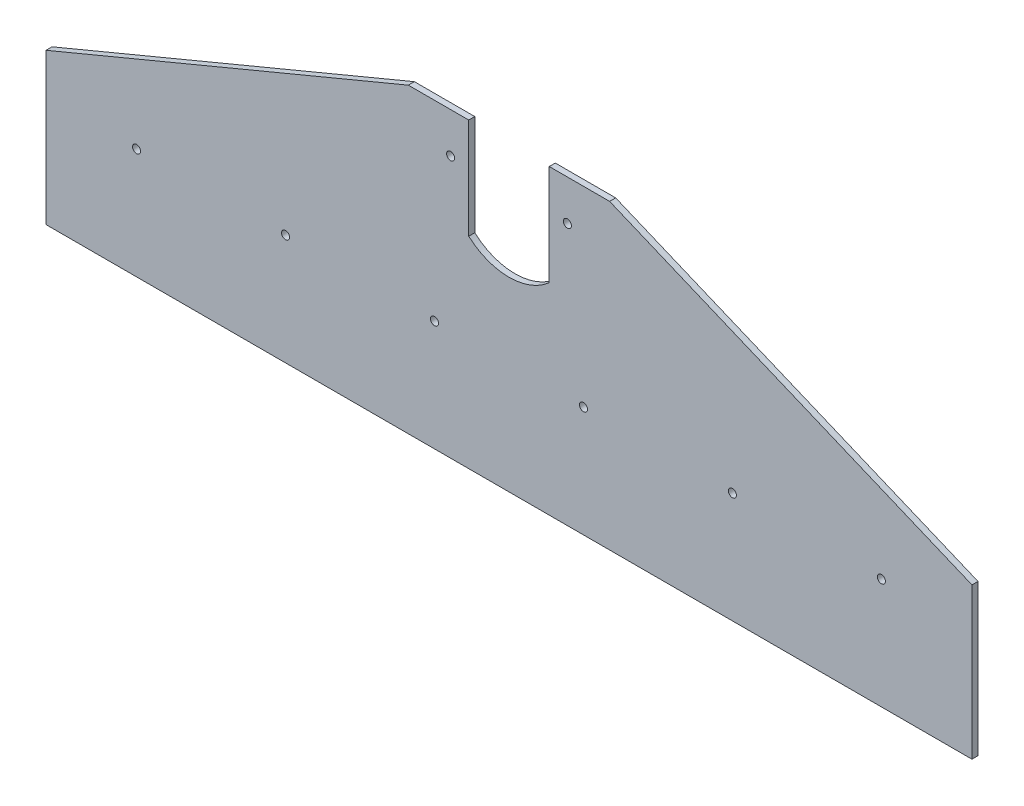
ISO-10303-21;
HEADER;
FILE_DESCRIPTION(('STEP AP214'),'2;1');
FILE_NAME('part.step','',(''),(''),'','','');
FILE_SCHEMA(('AUTOMOTIVE_DESIGN { 1 0 10303 214 1 1 1 1 }'));
ENDSEC;
DATA;
#1=APPLICATION_CONTEXT('core data for automotive mechanical design processes');
#2=APPLICATION_PROTOCOL_DEFINITION('international standard','automotive_design',2000,#1);
#3=PRODUCT_CONTEXT('',#1,'mechanical');
#4=PRODUCT('Part','Part','',(#3));
#5=PRODUCT_RELATED_PRODUCT_CATEGORY('part','',(#4));
#6=PRODUCT_DEFINITION_FORMATION('','',#4);
#7=PRODUCT_DEFINITION_CONTEXT('part definition',#1,'design');
#8=PRODUCT_DEFINITION('design','',#6,#7);
#9=PRODUCT_DEFINITION_SHAPE('','',#8);
#10=(LENGTH_UNIT() NAMED_UNIT(*) SI_UNIT(.MILLI.,.METRE.));
#11=(NAMED_UNIT(*) PLANE_ANGLE_UNIT() SI_UNIT($,.RADIAN.));
#12=(NAMED_UNIT(*) SI_UNIT($,.STERADIAN.) SOLID_ANGLE_UNIT());
#13=UNCERTAINTY_MEASURE_WITH_UNIT(LENGTH_MEASURE(1.E-05),#10,'distance_accuracy_value','');
#14=(GEOMETRIC_REPRESENTATION_CONTEXT(3) GLOBAL_UNCERTAINTY_ASSIGNED_CONTEXT((#13)) GLOBAL_UNIT_ASSIGNED_CONTEXT((#10,
#11,#12)) REPRESENTATION_CONTEXT('',''));
#15=CARTESIAN_POINT('',(0.,0.,0.));
#16=DIRECTION('',(0.,0.,1.));
#17=DIRECTION('',(1.,0.,0.));
#18=AXIS2_PLACEMENT_3D('',#15,#16,#17);
#19=CARTESIAN_POINT('',(180.,150.,3.));
#20=DIRECTION('',(0.,-1.,0.));
#21=DIRECTION('',(0.,0.,-1.));
#22=AXIS2_PLACEMENT_3D('',#19,#20,#21);
#23=PLANE('',#22);
#24=DIRECTION('',(-1.,0.,0.));
#25=VECTOR('',#24,1.);
#26=CARTESIAN_POINT('',(180.,150.,3.));
#27=LINE('',#26,#25);
#28=CARTESIAN_POINT('',(210.,150.,3.));
#29=VERTEX_POINT('',#28);
#30=CARTESIAN_POINT('',(180.,150.,3.));
#31=VERTEX_POINT('',#30);
#32=EDGE_CURVE('E118',#29,#31,#27,.T.);
#33=ORIENTED_EDGE('',*,*,#32,.F.);
#34=DIRECTION('',(0.,0.,1.));
#35=VECTOR('',#34,1.);
#36=CARTESIAN_POINT('',(210.,150.,0.));
#37=LINE('',#36,#35);
#38=CARTESIAN_POINT('',(210.,150.,0.));
#39=VERTEX_POINT('',#38);
#40=EDGE_CURVE('E183',#39,#29,#37,.T.);
#41=ORIENTED_EDGE('',*,*,#40,.F.);
#42=DIRECTION('',(-1.,0.,0.));
#43=VECTOR('',#42,1.);
#44=CARTESIAN_POINT('',(180.,150.,0.));
#45=LINE('',#44,#43);
#46=CARTESIAN_POINT('',(180.,150.,0.));
#47=VERTEX_POINT('',#46);
#48=EDGE_CURVE('E148',#39,#47,#45,.T.);
#49=ORIENTED_EDGE('',*,*,#48,.T.);
#50=DIRECTION('',(0.,0.,-1.));
#51=VECTOR('',#50,1.);
#52=CARTESIAN_POINT('',(180.,150.,3.));
#53=LINE('',#52,#51);
#54=EDGE_CURVE('E129',#31,#47,#53,.T.);
#55=ORIENTED_EDGE('',*,*,#54,.F.);
#56=EDGE_LOOP('',(#33,#41,#49,#55));
#57=FACE_BOUND('',#56,.T.);
#58=ADVANCED_FACE('F35',(#57),#23,.F.);
#59=CARTESIAN_POINT('',(0.,0.,3.));
#60=DIRECTION('',(1.,0.,0.));
#61=DIRECTION('',(0.,0.,-1.));
#62=AXIS2_PLACEMENT_3D('',#59,#60,#61);
#63=PLANE('',#62);
#64=DIRECTION('',(0.,-1.,0.));
#65=VECTOR('',#64,1.);
#66=CARTESIAN_POINT('',(0.,0.,0.));
#67=LINE('',#66,#65);
#68=CARTESIAN_POINT('',(0.,75.,0.));
#69=VERTEX_POINT('',#68);
#70=CARTESIAN_POINT('',(0.,0.,0.));
#71=VERTEX_POINT('',#70);
#72=EDGE_CURVE('E139',#69,#71,#67,.T.);
#73=ORIENTED_EDGE('',*,*,#72,.T.);
#74=DIRECTION('',(0.,0.,-1.));
#75=VECTOR('',#74,1.);
#76=CARTESIAN_POINT('',(0.,0.,3.));
#77=LINE('',#76,#75);
#78=CARTESIAN_POINT('',(0.,0.,3.));
#79=VERTEX_POINT('',#78);
#80=EDGE_CURVE('E11',#79,#71,#77,.T.);
#81=ORIENTED_EDGE('',*,*,#80,.F.);
#82=DIRECTION('',(0.,-1.,0.));
#83=VECTOR('',#82,1.);
#84=CARTESIAN_POINT('',(0.,0.,3.));
#85=LINE('',#84,#83);
#86=CARTESIAN_POINT('',(0.,75.,3.));
#87=VERTEX_POINT('',#86);
#88=EDGE_CURVE('E152',#87,#79,#85,.T.);
#89=ORIENTED_EDGE('',*,*,#88,.F.);
#90=DIRECTION('',(0.,0.,-1.));
#91=VECTOR('',#90,1.);
#92=CARTESIAN_POINT('',(0.,75.,3.));
#93=LINE('',#92,#91);
#94=EDGE_CURVE('E135',#87,#69,#93,.T.);
#95=ORIENTED_EDGE('',*,*,#94,.T.);
#96=EDGE_LOOP('',(#73,#81,#89,#95));
#97=FACE_BOUND('',#96,.T.);
#98=ADVANCED_FACE('F37',(#97),#63,.F.);
#99=CARTESIAN_POINT('',(0.,0.,3.));
#100=DIRECTION('',(0.,1.,0.));
#101=DIRECTION('',(0.,0.,1.));
#102=AXIS2_PLACEMENT_3D('',#99,#100,#101);
#103=PLANE('',#102);
#104=DIRECTION('',(1.,0.,0.));
#105=VECTOR('',#104,1.);
#106=CARTESIAN_POINT('',(0.,0.,0.));
#107=LINE('',#106,#105);
#108=CARTESIAN_POINT('',(460.,0.,0.));
#109=VERTEX_POINT('',#108);
#110=EDGE_CURVE('E142',#71,#109,#107,.T.);
#111=ORIENTED_EDGE('',*,*,#110,.T.);
#112=DIRECTION('',(0.,0.,-1.));
#113=VECTOR('',#112,1.);
#114=CARTESIAN_POINT('',(460.,0.,3.));
#115=LINE('',#114,#113);
#116=CARTESIAN_POINT('',(460.,0.,3.));
#117=VERTEX_POINT('',#116);
#118=EDGE_CURVE('E43',#117,#109,#115,.T.);
#119=ORIENTED_EDGE('',*,*,#118,.F.);
#120=DIRECTION('',(1.,0.,0.));
#121=VECTOR('',#120,1.);
#122=CARTESIAN_POINT('',(0.,0.,3.));
#123=LINE('',#122,#121);
#124=EDGE_CURVE('E94',#79,#117,#123,.T.);
#125=ORIENTED_EDGE('',*,*,#124,.F.);
#126=ORIENTED_EDGE('',*,*,#80,.T.);
#127=EDGE_LOOP('',(#111,#119,#125,#126));
#128=FACE_BOUND('',#127,.T.);
#129=ADVANCED_FACE('F304',(#128),#103,.F.);
#130=CARTESIAN_POINT('',(460.,0.,3.));
#131=DIRECTION('',(-1.,0.,0.));
#132=DIRECTION('',(0.,0.,1.));
#133=AXIS2_PLACEMENT_3D('',#130,#131,#132);
#134=PLANE('',#133);
#135=DIRECTION('',(0.,1.,0.));
#136=VECTOR('',#135,1.);
#137=CARTESIAN_POINT('',(460.,0.,0.));
#138=LINE('',#137,#136);
#139=CARTESIAN_POINT('',(460.,75.,0.));
#140=VERTEX_POINT('',#139);
#141=EDGE_CURVE('E145',#109,#140,#138,.T.);
#142=ORIENTED_EDGE('',*,*,#141,.T.);
#143=DIRECTION('',(0.,0.,-1.));
#144=VECTOR('',#143,1.);
#145=CARTESIAN_POINT('',(460.,75.,3.));
#146=LINE('',#145,#144);
#147=CARTESIAN_POINT('',(460.,75.,3.));
#148=VERTEX_POINT('',#147);
#149=EDGE_CURVE('E128',#148,#140,#146,.T.);
#150=ORIENTED_EDGE('',*,*,#149,.F.);
#151=DIRECTION('',(0.,1.,0.));
#152=VECTOR('',#151,1.);
#153=CARTESIAN_POINT('',(460.,0.,3.));
#154=LINE('',#153,#152);
#155=EDGE_CURVE('E114',#117,#148,#154,.T.);
#156=ORIENTED_EDGE('',*,*,#155,.F.);
#157=ORIENTED_EDGE('',*,*,#118,.T.);
#158=EDGE_LOOP('',(#142,#150,#156,#157));
#159=FACE_BOUND('',#158,.T.);
#160=ADVANCED_FACE('F158',(#159),#134,.F.);
#161=CARTESIAN_POINT('',(280.,150.,3.));
#162=DIRECTION('',(-0.384615384615385,-0.923076923076923,0.));
#163=DIRECTION('',(0.923076923076923,-0.384615384615385,0.));
#164=AXIS2_PLACEMENT_3D('',#161,#162,#163);
#165=PLANE('',#164);
#166=DIRECTION('',(-0.923076923076923,0.384615384615385,0.));
#167=VECTOR('',#166,1.);
#168=CARTESIAN_POINT('',(280.,150.,0.));
#169=LINE('',#168,#167);
#170=CARTESIAN_POINT('',(280.,150.,0.));
#171=VERTEX_POINT('',#170);
#172=EDGE_CURVE('E124',#140,#171,#169,.T.);
#173=ORIENTED_EDGE('',*,*,#172,.T.);
#174=DIRECTION('',(0.,0.,-1.));
#175=VECTOR('',#174,1.);
#176=CARTESIAN_POINT('',(280.,150.,3.));
#177=LINE('',#176,#175);
#178=CARTESIAN_POINT('',(280.,150.,3.));
#179=VERTEX_POINT('',#178);
#180=EDGE_CURVE('E121',#179,#171,#177,.T.);
#181=ORIENTED_EDGE('',*,*,#180,.F.);
#182=DIRECTION('',(-0.923076923076923,0.384615384615385,0.));
#183=VECTOR('',#182,1.);
#184=CARTESIAN_POINT('',(280.,150.,3.));
#185=LINE('',#184,#183);
#186=EDGE_CURVE('E105',#148,#179,#185,.T.);
#187=ORIENTED_EDGE('',*,*,#186,.F.);
#188=ORIENTED_EDGE('',*,*,#149,.T.);
#189=EDGE_LOOP('',(#173,#181,#187,#188));
#190=FACE_BOUND('',#189,.T.);
#191=ADVANCED_FACE('F122',(#190),#165,.F.);
#192=CARTESIAN_POINT('',(250.,150.,0.));
#193=VERTEX_POINT('',#192);
#194=EDGE_CURVE('E149',#171,#193,#45,.T.);
#195=ORIENTED_EDGE('',*,*,#194,.T.);
#196=DIRECTION('',(0.,0.,1.));
#197=VECTOR('',#196,1.);
#198=CARTESIAN_POINT('',(250.,150.,0.));
#199=LINE('',#198,#197);
#200=CARTESIAN_POINT('',(250.,150.,3.));
#201=VERTEX_POINT('',#200);
#202=EDGE_CURVE('E133',#193,#201,#199,.T.);
#203=ORIENTED_EDGE('',*,*,#202,.T.);
#204=EDGE_CURVE('E112',#179,#201,#27,.T.);
#205=ORIENTED_EDGE('',*,*,#204,.F.);
#206=ORIENTED_EDGE('',*,*,#180,.T.);
#207=EDGE_LOOP('',(#195,#203,#205,#206));
#208=FACE_BOUND('',#207,.T.);
#209=ADVANCED_FACE('F132',(#208),#23,.F.);
#210=CARTESIAN_POINT('',(0.,75.,3.));
#211=DIRECTION('',(0.384615384615385,-0.923076923076923,0.));
#212=DIRECTION('',(0.923076923076923,0.384615384615385,0.));
#213=AXIS2_PLACEMENT_3D('',#210,#211,#212);
#214=PLANE('',#213);
#215=DIRECTION('',(-0.923076923076923,-0.384615384615385,0.));
#216=VECTOR('',#215,1.);
#217=CARTESIAN_POINT('',(0.,75.,0.));
#218=LINE('',#217,#216);
#219=EDGE_CURVE('E86',#47,#69,#218,.T.);
#220=ORIENTED_EDGE('',*,*,#219,.T.);
#221=ORIENTED_EDGE('',*,*,#94,.F.);
#222=DIRECTION('',(-0.923076923076923,-0.384615384615385,0.));
#223=VECTOR('',#222,1.);
#224=CARTESIAN_POINT('',(0.,75.,3.));
#225=LINE('',#224,#223);
#226=EDGE_CURVE('E59',#31,#87,#225,.T.);
#227=ORIENTED_EDGE('',*,*,#226,.F.);
#228=ORIENTED_EDGE('',*,*,#54,.T.);
#229=EDGE_LOOP('',(#220,#221,#227,#228));
#230=FACE_BOUND('',#229,.T.);
#231=ADVANCED_FACE('F198',(#230),#214,.F.);
#232=CARTESIAN_POINT('',(0.,0.,3.));
#233=DIRECTION('',(0.,0.,-1.));
#234=DIRECTION('',(-1.,0.,0.));
#235=AXIS2_PLACEMENT_3D('',#232,#233,#234);
#236=PLANE('',#235);
#237=CARTESIAN_POINT('',(259.,130.,3.));
#238=DIRECTION('',(0.,0.,1.));
#239=DIRECTION('',(1.,0.,0.));
#240=AXIS2_PLACEMENT_3D('',#237,#238,#239);
#241=CIRCLE('',#240,2.);
#242=CARTESIAN_POINT('',(261.,130.,3.));
#243=VERTEX_POINT('',#242);
#244=EDGE_CURVE('E238',#243,#243,#241,.T.);
#245=ORIENTED_EDGE('',*,*,#244,.F.);
#246=EDGE_LOOP('',(#245));
#247=FACE_BOUND('',#246,.T.);
#248=CARTESIAN_POINT('',(201.,130.,3.));
#249=DIRECTION('',(0.,0.,1.));
#250=DIRECTION('',(1.,0.,0.));
#251=AXIS2_PLACEMENT_3D('',#248,#249,#250);
#252=CIRCLE('',#251,2.);
#253=CARTESIAN_POINT('',(203.,130.,3.));
#254=VERTEX_POINT('',#253);
#255=EDGE_CURVE('E244',#254,#254,#252,.T.);
#256=ORIENTED_EDGE('',*,*,#255,.F.);
#257=EDGE_LOOP('',(#256));
#258=FACE_BOUND('',#257,.T.);
#259=CARTESIAN_POINT('',(415.,55.,3.));
#260=DIRECTION('',(0.,0.,1.));
#261=DIRECTION('',(1.,0.,0.));
#262=AXIS2_PLACEMENT_3D('',#259,#260,#261);
#263=CIRCLE('',#262,2.00000000000005);
#264=CARTESIAN_POINT('',(417.,55.,3.));
#265=VERTEX_POINT('',#264);
#266=EDGE_CURVE('E250',#265,#265,#263,.T.);
#267=ORIENTED_EDGE('',*,*,#266,.F.);
#268=EDGE_LOOP('',(#267));
#269=FACE_BOUND('',#268,.T.);
#270=CARTESIAN_POINT('',(341.,55.,3.));
#271=DIRECTION('',(0.,0.,1.));
#272=DIRECTION('',(1.,0.,0.));
#273=AXIS2_PLACEMENT_3D('',#270,#271,#272);
#274=CIRCLE('',#273,2.);
#275=CARTESIAN_POINT('',(343.,55.,3.));
#276=VERTEX_POINT('',#275);
#277=EDGE_CURVE('E256',#276,#276,#274,.T.);
#278=ORIENTED_EDGE('',*,*,#277,.F.);
#279=EDGE_LOOP('',(#278));
#280=FACE_BOUND('',#279,.T.);
#281=CARTESIAN_POINT('',(119.,55.,3.));
#282=DIRECTION('',(0.,0.,1.));
#283=DIRECTION('',(1.,0.,0.));
#284=AXIS2_PLACEMENT_3D('',#281,#282,#283);
#285=CIRCLE('',#284,2.00000000000001);
#286=CARTESIAN_POINT('',(121.,55.,3.));
#287=VERTEX_POINT('',#286);
#288=EDGE_CURVE('E209',#287,#287,#285,.T.);
#289=ORIENTED_EDGE('',*,*,#288,.F.);
#290=EDGE_LOOP('',(#289));
#291=FACE_BOUND('',#290,.T.);
#292=CARTESIAN_POINT('',(193.,55.,3.));
#293=DIRECTION('',(0.,0.,1.));
#294=DIRECTION('',(1.,0.,0.));
#295=AXIS2_PLACEMENT_3D('',#292,#293,#294);
#296=CIRCLE('',#295,2.);
#297=CARTESIAN_POINT('',(195.,55.,3.));
#298=VERTEX_POINT('',#297);
#299=EDGE_CURVE('E233',#298,#298,#296,.T.);
#300=ORIENTED_EDGE('',*,*,#299,.F.);
#301=EDGE_LOOP('',(#300));
#302=FACE_BOUND('',#301,.T.);
#303=CARTESIAN_POINT('',(267.,55.,3.));
#304=DIRECTION('',(0.,0.,1.));
#305=DIRECTION('',(1.,0.,0.));
#306=AXIS2_PLACEMENT_3D('',#303,#304,#305);
#307=CIRCLE('',#306,2.00000000000005);
#308=CARTESIAN_POINT('',(269.,55.,3.));
#309=VERTEX_POINT('',#308);
#310=EDGE_CURVE('E226',#309,#309,#307,.T.);
#311=ORIENTED_EDGE('',*,*,#310,.F.);
#312=EDGE_LOOP('',(#311));
#313=FACE_BOUND('',#312,.T.);
#314=CARTESIAN_POINT('',(45.,55.,3.));
#315=DIRECTION('',(0.,0.,1.));
#316=DIRECTION('',(1.,0.,0.));
#317=AXIS2_PLACEMENT_3D('',#314,#315,#316);
#318=CIRCLE('',#317,2.);
#319=CARTESIAN_POINT('',(47.,55.,3.));
#320=VERTEX_POINT('',#319);
#321=EDGE_CURVE('E191',#320,#320,#318,.T.);
#322=ORIENTED_EDGE('',*,*,#321,.F.);
#323=EDGE_LOOP('',(#322));
#324=FACE_BOUND('',#323,.T.);
#325=CARTESIAN_POINT('',(230.,122.360679774998,3.));
#326=DIRECTION('',(0.,0.,1.));
#327=DIRECTION('',(1.,0.,0.));
#328=AXIS2_PLACEMENT_3D('',#325,#326,#327);
#329=CIRCLE('',#328,30.);
#330=CARTESIAN_POINT('',(210.,100.,3.));
#331=VERTEX_POINT('',#330);
#332=CARTESIAN_POINT('',(250.,100.,3.));
#333=VERTEX_POINT('',#332);
#334=EDGE_CURVE('E195',#331,#333,#329,.T.);
#335=ORIENTED_EDGE('',*,*,#334,.F.);
#336=DIRECTION('',(0.,-1.,0.));
#337=VECTOR('',#336,1.);
#338=CARTESIAN_POINT('',(210.,150.,3.));
#339=LINE('',#338,#337);
#340=EDGE_CURVE('E186',#29,#331,#339,.T.);
#341=ORIENTED_EDGE('',*,*,#340,.F.);
#342=ORIENTED_EDGE('',*,*,#32,.T.);
#343=ORIENTED_EDGE('',*,*,#226,.T.);
#344=ORIENTED_EDGE('',*,*,#88,.T.);
#345=ORIENTED_EDGE('',*,*,#124,.T.);
#346=ORIENTED_EDGE('',*,*,#155,.T.);
#347=ORIENTED_EDGE('',*,*,#186,.T.);
#348=ORIENTED_EDGE('',*,*,#204,.T.);
#349=DIRECTION('',(0.,1.,0.));
#350=VECTOR('',#349,1.);
#351=CARTESIAN_POINT('',(250.,150.,3.));
#352=LINE('',#351,#350);
#353=EDGE_CURVE('E178',#333,#201,#352,.T.);
#354=ORIENTED_EDGE('',*,*,#353,.F.);
#355=EDGE_LOOP('',(#335,#341,#342,#343,#344,#345,#346,#347,#348,#354));
#356=FACE_BOUND('',#355,.T.);
#357=ADVANCED_FACE('F108',(#247,#258,#269,#280,#291,#302,#313,#324,#356),#236,.F.);
#358=CARTESIAN_POINT('',(0.,0.,0.));
#359=DIRECTION('',(0.,0.,-1.));
#360=DIRECTION('',(-1.,0.,0.));
#361=AXIS2_PLACEMENT_3D('',#358,#359,#360);
#362=PLANE('',#361);
#363=CARTESIAN_POINT('',(259.,130.,0.));
#364=DIRECTION('',(0.,0.,1.));
#365=DIRECTION('',(1.,0.,0.));
#366=AXIS2_PLACEMENT_3D('',#363,#364,#365);
#367=CIRCLE('',#366,2.);
#368=CARTESIAN_POINT('',(261.,130.,0.));
#369=VERTEX_POINT('',#368);
#370=EDGE_CURVE('E241',#369,#369,#367,.T.);
#371=ORIENTED_EDGE('',*,*,#370,.T.);
#372=EDGE_LOOP('',(#371));
#373=FACE_BOUND('',#372,.T.);
#374=CARTESIAN_POINT('',(201.,130.,0.));
#375=DIRECTION('',(0.,0.,1.));
#376=DIRECTION('',(1.,0.,0.));
#377=AXIS2_PLACEMENT_3D('',#374,#375,#376);
#378=CIRCLE('',#377,2.);
#379=CARTESIAN_POINT('',(203.,130.,0.));
#380=VERTEX_POINT('',#379);
#381=EDGE_CURVE('E247',#380,#380,#378,.T.);
#382=ORIENTED_EDGE('',*,*,#381,.T.);
#383=EDGE_LOOP('',(#382));
#384=FACE_BOUND('',#383,.T.);
#385=CARTESIAN_POINT('',(415.,55.,0.));
#386=DIRECTION('',(0.,0.,1.));
#387=DIRECTION('',(1.,0.,0.));
#388=AXIS2_PLACEMENT_3D('',#385,#386,#387);
#389=CIRCLE('',#388,2.00000000000005);
#390=CARTESIAN_POINT('',(417.,55.,0.));
#391=VERTEX_POINT('',#390);
#392=EDGE_CURVE('E253',#391,#391,#389,.T.);
#393=ORIENTED_EDGE('',*,*,#392,.T.);
#394=EDGE_LOOP('',(#393));
#395=FACE_BOUND('',#394,.T.);
#396=CARTESIAN_POINT('',(341.,55.,0.));
#397=DIRECTION('',(0.,0.,1.));
#398=DIRECTION('',(1.,0.,0.));
#399=AXIS2_PLACEMENT_3D('',#396,#397,#398);
#400=CIRCLE('',#399,2.);
#401=CARTESIAN_POINT('',(343.,55.,0.));
#402=VERTEX_POINT('',#401);
#403=EDGE_CURVE('E230',#402,#402,#400,.T.);
#404=ORIENTED_EDGE('',*,*,#403,.T.);
#405=EDGE_LOOP('',(#404));
#406=FACE_BOUND('',#405,.T.);
#407=DIRECTION('',(0.,-1.,0.));
#408=VECTOR('',#407,1.);
#409=CARTESIAN_POINT('',(210.,150.,0.));
#410=LINE('',#409,#408);
#411=CARTESIAN_POINT('',(210.,100.,0.));
#412=VERTEX_POINT('',#411);
#413=EDGE_CURVE('E187',#39,#412,#410,.T.);
#414=ORIENTED_EDGE('',*,*,#413,.T.);
#415=CARTESIAN_POINT('',(230.,122.360679774998,0.));
#416=DIRECTION('',(0.,0.,1.));
#417=DIRECTION('',(1.,0.,0.));
#418=AXIS2_PLACEMENT_3D('',#415,#416,#417);
#419=CIRCLE('',#418,30.);
#420=CARTESIAN_POINT('',(250.,100.,0.));
#421=VERTEX_POINT('',#420);
#422=EDGE_CURVE('E223',#412,#421,#419,.T.);
#423=ORIENTED_EDGE('',*,*,#422,.T.);
#424=DIRECTION('',(0.,1.,0.));
#425=VECTOR('',#424,1.);
#426=CARTESIAN_POINT('',(250.,150.,0.));
#427=LINE('',#426,#425);
#428=EDGE_CURVE('E50',#421,#193,#427,.T.);
#429=ORIENTED_EDGE('',*,*,#428,.T.);
#430=ORIENTED_EDGE('',*,*,#194,.F.);
#431=ORIENTED_EDGE('',*,*,#172,.F.);
#432=ORIENTED_EDGE('',*,*,#141,.F.);
#433=ORIENTED_EDGE('',*,*,#110,.F.);
#434=ORIENTED_EDGE('',*,*,#72,.F.);
#435=ORIENTED_EDGE('',*,*,#219,.F.);
#436=ORIENTED_EDGE('',*,*,#48,.F.);
#437=EDGE_LOOP('',(#414,#423,#429,#430,#431,#432,#433,#434,#435,#436));
#438=FACE_BOUND('',#437,.T.);
#439=CARTESIAN_POINT('',(119.,55.,0.));
#440=DIRECTION('',(0.,0.,1.));
#441=DIRECTION('',(1.,0.,0.));
#442=AXIS2_PLACEMENT_3D('',#439,#440,#441);
#443=CIRCLE('',#442,2.00000000000001);
#444=CARTESIAN_POINT('',(121.,55.,0.));
#445=VERTEX_POINT('',#444);
#446=EDGE_CURVE('E196',#445,#445,#443,.T.);
#447=ORIENTED_EDGE('',*,*,#446,.T.);
#448=EDGE_LOOP('',(#447));
#449=FACE_BOUND('',#448,.T.);
#450=CARTESIAN_POINT('',(193.,55.,0.));
#451=DIRECTION('',(0.,0.,1.));
#452=DIRECTION('',(1.,0.,0.));
#453=AXIS2_PLACEMENT_3D('',#450,#451,#452);
#454=CIRCLE('',#453,2.);
#455=CARTESIAN_POINT('',(195.,55.,0.));
#456=VERTEX_POINT('',#455);
#457=EDGE_CURVE('E212',#456,#456,#454,.T.);
#458=ORIENTED_EDGE('',*,*,#457,.T.);
#459=EDGE_LOOP('',(#458));
#460=FACE_BOUND('',#459,.T.);
#461=CARTESIAN_POINT('',(267.,55.,0.));
#462=DIRECTION('',(0.,0.,1.));
#463=DIRECTION('',(1.,0.,0.));
#464=AXIS2_PLACEMENT_3D('',#461,#462,#463);
#465=CIRCLE('',#464,2.00000000000005);
#466=CARTESIAN_POINT('',(269.,55.,0.));
#467=VERTEX_POINT('',#466);
#468=EDGE_CURVE('E229',#467,#467,#465,.T.);
#469=ORIENTED_EDGE('',*,*,#468,.T.);
#470=EDGE_LOOP('',(#469));
#471=FACE_BOUND('',#470,.T.);
#472=CARTESIAN_POINT('',(45.,55.,0.));
#473=DIRECTION('',(0.,0.,1.));
#474=DIRECTION('',(1.,0.,0.));
#475=AXIS2_PLACEMENT_3D('',#472,#473,#474);
#476=CIRCLE('',#475,2.);
#477=CARTESIAN_POINT('',(47.,55.,0.));
#478=VERTEX_POINT('',#477);
#479=EDGE_CURVE('E143',#478,#478,#476,.T.);
#480=ORIENTED_EDGE('',*,*,#479,.T.);
#481=EDGE_LOOP('',(#480));
#482=FACE_BOUND('',#481,.T.);
#483=ADVANCED_FACE('F161',(#373,#384,#395,#406,#438,#449,#460,#471,#482),#362,.T.);
#484=CARTESIAN_POINT('',(45.,55.,0.));
#485=DIRECTION('',(0.,0.,1.));
#486=DIRECTION('',(1.,0.,0.));
#487=AXIS2_PLACEMENT_3D('',#484,#485,#486);
#488=CYLINDRICAL_SURFACE('',#487,2.);
#489=ORIENTED_EDGE('',*,*,#479,.F.);
#490=EDGE_LOOP('',(#489));
#491=FACE_BOUND('',#490,.T.);
#492=ORIENTED_EDGE('',*,*,#321,.T.);
#493=EDGE_LOOP('',(#492));
#494=FACE_BOUND('',#493,.T.);
#495=ADVANCED_FACE('F283',(#491,#494),#488,.F.);
#496=CARTESIAN_POINT('',(267.,55.,0.));
#497=DIRECTION('',(0.,0.,1.));
#498=DIRECTION('',(1.,0.,0.));
#499=AXIS2_PLACEMENT_3D('',#496,#497,#498);
#500=CYLINDRICAL_SURFACE('',#499,2.00000000000005);
#501=ORIENTED_EDGE('',*,*,#468,.F.);
#502=EDGE_LOOP('',(#501));
#503=FACE_BOUND('',#502,.T.);
#504=ORIENTED_EDGE('',*,*,#310,.T.);
#505=EDGE_LOOP('',(#504));
#506=FACE_BOUND('',#505,.T.);
#507=ADVANCED_FACE('F285',(#503,#506),#500,.F.);
#508=CARTESIAN_POINT('',(193.,55.,0.));
#509=DIRECTION('',(0.,0.,1.));
#510=DIRECTION('',(1.,0.,0.));
#511=AXIS2_PLACEMENT_3D('',#508,#509,#510);
#512=CYLINDRICAL_SURFACE('',#511,2.);
#513=ORIENTED_EDGE('',*,*,#457,.F.);
#514=EDGE_LOOP('',(#513));
#515=FACE_BOUND('',#514,.T.);
#516=ORIENTED_EDGE('',*,*,#299,.T.);
#517=EDGE_LOOP('',(#516));
#518=FACE_BOUND('',#517,.T.);
#519=ADVANCED_FACE('F292',(#515,#518),#512,.F.);
#520=CARTESIAN_POINT('',(119.,55.,0.));
#521=DIRECTION('',(0.,0.,1.));
#522=DIRECTION('',(1.,0.,0.));
#523=AXIS2_PLACEMENT_3D('',#520,#521,#522);
#524=CYLINDRICAL_SURFACE('',#523,2.00000000000001);
#525=ORIENTED_EDGE('',*,*,#446,.F.);
#526=EDGE_LOOP('',(#525));
#527=FACE_BOUND('',#526,.T.);
#528=ORIENTED_EDGE('',*,*,#288,.T.);
#529=EDGE_LOOP('',(#528));
#530=FACE_BOUND('',#529,.T.);
#531=ADVANCED_FACE('F329',(#527,#530),#524,.F.);
#532=CARTESIAN_POINT('',(210.,150.,0.));
#533=DIRECTION('',(-1.,0.,0.));
#534=DIRECTION('',(0.,-1.,0.));
#535=AXIS2_PLACEMENT_3D('',#532,#533,#534);
#536=PLANE('',#535);
#537=ORIENTED_EDGE('',*,*,#340,.T.);
#538=DIRECTION('',(0.,0.,1.));
#539=VECTOR('',#538,1.);
#540=CARTESIAN_POINT('',(210.,100.,0.));
#541=LINE('',#540,#539);
#542=EDGE_CURVE('E215',#412,#331,#541,.T.);
#543=ORIENTED_EDGE('',*,*,#542,.F.);
#544=ORIENTED_EDGE('',*,*,#413,.F.);
#545=ORIENTED_EDGE('',*,*,#40,.T.);
#546=EDGE_LOOP('',(#537,#543,#544,#545));
#547=FACE_BOUND('',#546,.T.);
#548=ADVANCED_FACE('F185',(#547),#536,.F.);
#549=CARTESIAN_POINT('',(250.,150.,0.));
#550=DIRECTION('',(1.,0.,0.));
#551=DIRECTION('',(0.,1.,0.));
#552=AXIS2_PLACEMENT_3D('',#549,#550,#551);
#553=PLANE('',#552);
#554=ORIENTED_EDGE('',*,*,#353,.T.);
#555=ORIENTED_EDGE('',*,*,#202,.F.);
#556=ORIENTED_EDGE('',*,*,#428,.F.);
#557=DIRECTION('',(0.,0.,1.));
#558=VECTOR('',#557,1.);
#559=CARTESIAN_POINT('',(250.,100.,0.));
#560=LINE('',#559,#558);
#561=EDGE_CURVE('E217',#421,#333,#560,.T.);
#562=ORIENTED_EDGE('',*,*,#561,.T.);
#563=EDGE_LOOP('',(#554,#555,#556,#562));
#564=FACE_BOUND('',#563,.T.);
#565=ADVANCED_FACE('F321',(#564),#553,.F.);
#566=CARTESIAN_POINT('',(230.,122.360679774998,0.));
#567=DIRECTION('',(0.,0.,1.));
#568=DIRECTION('',(1.,0.,0.));
#569=AXIS2_PLACEMENT_3D('',#566,#567,#568);
#570=CYLINDRICAL_SURFACE('',#569,30.);
#571=ORIENTED_EDGE('',*,*,#334,.T.);
#572=ORIENTED_EDGE('',*,*,#561,.F.);
#573=ORIENTED_EDGE('',*,*,#422,.F.);
#574=ORIENTED_EDGE('',*,*,#542,.T.);
#575=EDGE_LOOP('',(#571,#572,#573,#574));
#576=FACE_BOUND('',#575,.T.);
#577=ADVANCED_FACE('F267',(#576),#570,.F.);
#578=CARTESIAN_POINT('',(341.,55.,0.));
#579=DIRECTION('',(0.,0.,1.));
#580=DIRECTION('',(1.,0.,0.));
#581=AXIS2_PLACEMENT_3D('',#578,#579,#580);
#582=CYLINDRICAL_SURFACE('',#581,2.);
#583=ORIENTED_EDGE('',*,*,#403,.F.);
#584=EDGE_LOOP('',(#583));
#585=FACE_BOUND('',#584,.T.);
#586=ORIENTED_EDGE('',*,*,#277,.T.);
#587=EDGE_LOOP('',(#586));
#588=FACE_BOUND('',#587,.T.);
#589=ADVANCED_FACE('F263',(#585,#588),#582,.F.);
#590=CARTESIAN_POINT('',(415.,55.,0.));
#591=DIRECTION('',(0.,0.,1.));
#592=DIRECTION('',(1.,0.,0.));
#593=AXIS2_PLACEMENT_3D('',#590,#591,#592);
#594=CYLINDRICAL_SURFACE('',#593,2.00000000000005);
#595=ORIENTED_EDGE('',*,*,#392,.F.);
#596=EDGE_LOOP('',(#595));
#597=FACE_BOUND('',#596,.T.);
#598=ORIENTED_EDGE('',*,*,#266,.T.);
#599=EDGE_LOOP('',(#598));
#600=FACE_BOUND('',#599,.T.);
#601=ADVANCED_FACE('F266',(#597,#600),#594,.F.);
#602=CARTESIAN_POINT('',(201.,130.,0.));
#603=DIRECTION('',(0.,0.,1.));
#604=DIRECTION('',(1.,0.,0.));
#605=AXIS2_PLACEMENT_3D('',#602,#603,#604);
#606=CYLINDRICAL_SURFACE('',#605,2.);
#607=ORIENTED_EDGE('',*,*,#381,.F.);
#608=EDGE_LOOP('',(#607));
#609=FACE_BOUND('',#608,.T.);
#610=ORIENTED_EDGE('',*,*,#255,.T.);
#611=EDGE_LOOP('',(#610));
#612=FACE_BOUND('',#611,.T.);
#613=ADVANCED_FACE('F353',(#609,#612),#606,.F.);
#614=CARTESIAN_POINT('',(259.,130.,0.));
#615=DIRECTION('',(0.,0.,1.));
#616=DIRECTION('',(1.,0.,0.));
#617=AXIS2_PLACEMENT_3D('',#614,#615,#616);
#618=CYLINDRICAL_SURFACE('',#617,2.);
#619=ORIENTED_EDGE('',*,*,#370,.F.);
#620=EDGE_LOOP('',(#619));
#621=FACE_BOUND('',#620,.T.);
#622=ORIENTED_EDGE('',*,*,#244,.T.);
#623=EDGE_LOOP('',(#622));
#624=FACE_BOUND('',#623,.T.);
#625=ADVANCED_FACE('F350',(#621,#624),#618,.F.);
#626=CLOSED_SHELL('',(#58,#98,#129,#160,#191,#209,#231,#357,#483,#495,#507,#519,#531,#548,#565,
#577,#589,#601,#613,#625));
#627=MANIFOLD_SOLID_BREP('B2',#626);
#628=ADVANCED_BREP_SHAPE_REPRESENTATION('',(#18,#627),#14);
#629=SHAPE_DEFINITION_REPRESENTATION(#9,#628);
ENDSEC;
END-ISO-10303-21;
